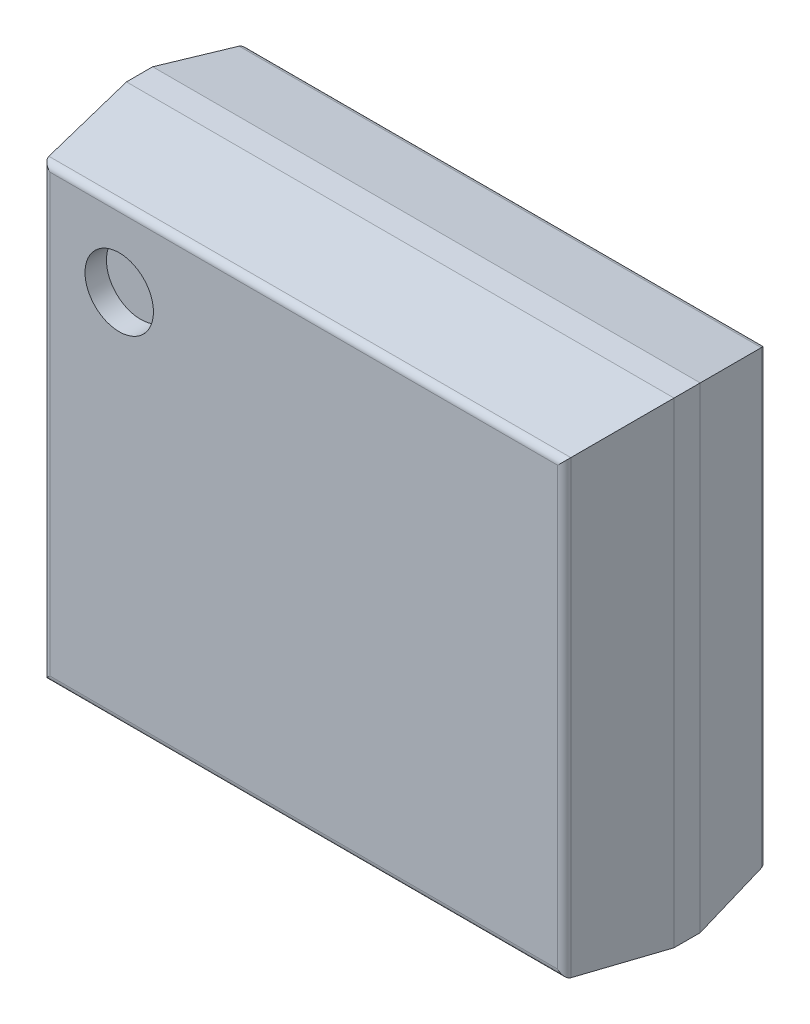
ISO-10303-21;
HEADER;
FILE_DESCRIPTION(('STEP AP214'),'2;1');
FILE_NAME('part.step','',(''),(''),'','','');
FILE_SCHEMA(('AUTOMOTIVE_DESIGN { 1 0 10303 214 1 1 1 1 }'));
ENDSEC;
DATA;
#1=APPLICATION_CONTEXT('core data for automotive mechanical design processes');
#2=APPLICATION_PROTOCOL_DEFINITION('international standard','automotive_design',2000,#1);
#3=PRODUCT_CONTEXT('',#1,'mechanical');
#4=PRODUCT('Part','Part','',(#3));
#5=PRODUCT_RELATED_PRODUCT_CATEGORY('part','',(#4));
#6=PRODUCT_DEFINITION_FORMATION('','',#4);
#7=PRODUCT_DEFINITION_CONTEXT('part definition',#1,'design');
#8=PRODUCT_DEFINITION('design','',#6,#7);
#9=PRODUCT_DEFINITION_SHAPE('','',#8);
#10=(LENGTH_UNIT() NAMED_UNIT(*) SI_UNIT(.MILLI.,.METRE.));
#11=(NAMED_UNIT(*) PLANE_ANGLE_UNIT() SI_UNIT($,.RADIAN.));
#12=(NAMED_UNIT(*) SI_UNIT($,.STERADIAN.) SOLID_ANGLE_UNIT());
#13=UNCERTAINTY_MEASURE_WITH_UNIT(LENGTH_MEASURE(1.E-05),#10,'distance_accuracy_value','');
#14=(GEOMETRIC_REPRESENTATION_CONTEXT(3) GLOBAL_UNCERTAINTY_ASSIGNED_CONTEXT((#13)) GLOBAL_UNIT_ASSIGNED_CONTEXT((#10,
#11,#12)) REPRESENTATION_CONTEXT('',''));
#15=CARTESIAN_POINT('',(0.,0.,0.));
#16=DIRECTION('',(0.,0.,1.));
#17=DIRECTION('',(1.,0.,0.));
#18=AXIS2_PLACEMENT_3D('',#15,#16,#17);
#19=CARTESIAN_POINT('',(-0.775,0.625,0.81));
#20=DIRECTION('',(0.,0.,1.));
#21=DIRECTION('',(1.,0.,0.));
#22=AXIS2_PLACEMENT_3D('',#19,#20,#21);
#23=PLANE('',#22);
#24=CARTESIAN_POINT('',(-0.775,0.625,0.81));
#25=DIRECTION('',(0.,0.,1.));
#26=DIRECTION('',(1.,0.,0.));
#27=AXIS2_PLACEMENT_3D('',#24,#25,#26);
#28=CIRCLE('',#27,0.14375);
#29=CARTESIAN_POINT('',(-0.63125,0.625,0.81));
#30=VERTEX_POINT('',#29);
#31=EDGE_CURVE('E20',#30,#30,#28,.T.);
#32=ORIENTED_EDGE('',*,*,#31,.T.);
#33=EDGE_LOOP('',(#32));
#34=FACE_BOUND('',#33,.T.);
#35=ADVANCED_FACE('F17',(#34),#23,.T.);
#36=CARTESIAN_POINT('',(-0.775,0.625,0.81));
#37=DIRECTION('',(0.,0.,1.));
#38=DIRECTION('',(1.,0.,0.));
#39=AXIS2_PLACEMENT_3D('',#36,#37,#38);
#40=CYLINDRICAL_SURFACE('',#39,0.14375);
#41=CARTESIAN_POINT('',(-0.775,0.625,0.9));
#42=DIRECTION('',(0.,0.,1.));
#43=DIRECTION('',(1.,0.,0.));
#44=AXIS2_PLACEMENT_3D('',#41,#42,#43);
#45=CIRCLE('',#44,0.14375);
#46=CARTESIAN_POINT('',(-0.63125,0.625,0.9));
#47=VERTEX_POINT('',#46);
#48=EDGE_CURVE('E100',#47,#47,#45,.F.);
#49=ORIENTED_EDGE('',*,*,#48,.F.);
#50=EDGE_LOOP('',(#49));
#51=FACE_BOUND('',#50,.T.);
#52=ORIENTED_EDGE('',*,*,#31,.F.);
#53=EDGE_LOOP('',(#52));
#54=FACE_BOUND('',#53,.T.);
#55=ADVANCED_FACE('F117',(#51,#54),#40,.F.);
#56=CARTESIAN_POINT('',(-1.15,-1.,0.9));
#57=DIRECTION('',(0.,0.,1.));
#58=DIRECTION('',(1.,0.,0.));
#59=AXIS2_PLACEMENT_3D('',#56,#57,#58);
#60=PLANE('',#59);
#61=ORIENTED_EDGE('',*,*,#48,.T.);
#62=EDGE_LOOP('',(#61));
#63=FACE_BOUND('',#62,.T.);
#64=DIRECTION('',(0.,1.,0.));
#65=VECTOR('',#64,1.);
#66=CARTESIAN_POINT('',(1.066455479683,-0.9425,0.9));
#67=LINE('',#66,#65);
#68=CARTESIAN_POINT('',(1.066455479683,0.916455479683,0.9));
#69=VERTEX_POINT('',#68);
#70=CARTESIAN_POINT('',(1.066455479683,-0.916455479683,0.9));
#71=VERTEX_POINT('',#70);
#72=EDGE_CURVE('E107',#69,#71,#67,.F.);
#73=ORIENTED_EDGE('',*,*,#72,.F.);
#74=DIRECTION('',(1.,0.,0.));
#75=VECTOR('',#74,1.);
#76=CARTESIAN_POINT('',(-1.0925,0.916455479683,0.9));
#77=LINE('',#76,#75);
#78=CARTESIAN_POINT('',(-1.066455479683,0.916455479683,0.9));
#79=VERTEX_POINT('',#78);
#80=EDGE_CURVE('E96',#79,#69,#77,.T.);
#81=ORIENTED_EDGE('',*,*,#80,.F.);
#82=DIRECTION('',(0.,1.,0.));
#83=VECTOR('',#82,1.);
#84=CARTESIAN_POINT('',(-1.066455479683,-0.9425,0.9));
#85=LINE('',#84,#83);
#86=CARTESIAN_POINT('',(-1.066455479683,-0.916455479683,0.9));
#87=VERTEX_POINT('',#86);
#88=EDGE_CURVE('E92',#87,#79,#85,.T.);
#89=ORIENTED_EDGE('',*,*,#88,.F.);
#90=DIRECTION('',(1.,0.,0.));
#91=VECTOR('',#90,1.);
#92=CARTESIAN_POINT('',(-1.0925,-0.916455479683,0.9));
#93=LINE('',#92,#91);
#94=EDGE_CURVE('E81',#71,#87,#93,.F.);
#95=ORIENTED_EDGE('',*,*,#94,.F.);
#96=EDGE_LOOP('',(#73,#81,#89,#95));
#97=FACE_BOUND('',#96,.T.);
#98=ADVANCED_FACE('F95',(#63,#97),#60,.T.);
#99=CARTESIAN_POINT('',(-1.066455479683,-0.9425,0.87));
#100=DIRECTION('',(0.,1.,0.));
#101=DIRECTION('',(0.,0.,1.));
#102=AXIS2_PLACEMENT_3D('',#99,#100,#101);
#103=CYLINDRICAL_SURFACE('',#102,0.03);
#104=CARTESIAN_POINT('',(-1.066455479683,0.916455479683,0.87));
#105=DIRECTION('',(0.707106781186547,0.707106781186547,0.));
#106=DIRECTION('',(0.707106781186547,-0.707106781186547,0.));
#107=AXIS2_PLACEMENT_3D('',#104,#105,#106);
#108=ELLIPSE('',#107,0.0424264068711928,0.03);
#109=CARTESIAN_POINT('',(-1.09615809039178,0.946158090391776,0.874213658398055));
#110=VERTEX_POINT('',#109);
#111=EDGE_CURVE('E363',#110,#79,#108,.T.);
#112=ORIENTED_EDGE('',*,*,#111,.F.);
#113=DIRECTION('',(0.,1.,0.));
#114=VECTOR('',#113,1.);
#115=CARTESIAN_POINT('',(-1.09615809039199,-1.,0.874213658397999));
#116=LINE('',#115,#114);
#117=CARTESIAN_POINT('',(-1.09615809039178,-0.946158090391776,0.874213658398055));
#118=VERTEX_POINT('',#117);
#119=EDGE_CURVE('E104',#110,#118,#116,.F.);
#120=ORIENTED_EDGE('',*,*,#119,.T.);
#121=CARTESIAN_POINT('',(-1.066455479683,-0.916455479683,0.87));
#122=DIRECTION('',(0.707106781186547,-0.707106781186547,0.));
#123=DIRECTION('',(0.707106781186547,0.707106781186547,0.));
#124=AXIS2_PLACEMENT_3D('',#121,#122,#123);
#125=ELLIPSE('',#124,0.0424264068711928,0.03);
#126=EDGE_CURVE('E86',#87,#118,#125,.T.);
#127=ORIENTED_EDGE('',*,*,#126,.F.);
#128=ORIENTED_EDGE('',*,*,#88,.T.);
#129=EDGE_LOOP('',(#112,#120,#127,#128));
#130=FACE_BOUND('',#129,.T.);
#131=ADVANCED_FACE('F103',(#130),#103,.T.);
#132=CARTESIAN_POINT('',(-1.0925,-0.916455479683,0.87));
#133=DIRECTION('',(1.,0.,0.));
#134=DIRECTION('',(0.,0.,-1.));
#135=AXIS2_PLACEMENT_3D('',#132,#133,#134);
#136=CYLINDRICAL_SURFACE('',#135,0.03);
#137=ORIENTED_EDGE('',*,*,#94,.T.);
#138=ORIENTED_EDGE('',*,*,#126,.T.);
#139=DIRECTION('',(1.,0.,0.));
#140=VECTOR('',#139,1.);
#141=CARTESIAN_POINT('',(-1.15,-0.946158090391995,0.874213658397999));
#142=LINE('',#141,#140);
#143=CARTESIAN_POINT('',(1.09615809039178,-0.946158090391778,0.874213658398055));
#144=VERTEX_POINT('',#143);
#145=EDGE_CURVE('E380',#118,#144,#142,.T.);
#146=ORIENTED_EDGE('',*,*,#145,.T.);
#147=CARTESIAN_POINT('',(1.066455479683,-0.916455479683,0.87));
#148=DIRECTION('',(0.707106781186547,0.707106781186547,0.));
#149=DIRECTION('',(-0.707106781186547,0.707106781186547,0.));
#150=AXIS2_PLACEMENT_3D('',#147,#148,#149);
#151=ELLIPSE('',#150,0.0424264068711928,0.03);
#152=EDGE_CURVE('E88',#71,#144,#151,.T.);
#153=ORIENTED_EDGE('',*,*,#152,.F.);
#154=EDGE_LOOP('',(#137,#138,#146,#153));
#155=FACE_BOUND('',#154,.T.);
#156=ADVANCED_FACE('F83',(#155),#136,.T.);
#157=CARTESIAN_POINT('',(1.066455479683,-0.9425,0.87));
#158=DIRECTION('',(0.,1.,0.));
#159=DIRECTION('',(0.,0.,1.));
#160=AXIS2_PLACEMENT_3D('',#157,#158,#159);
#161=CYLINDRICAL_SURFACE('',#160,0.03);
#162=CARTESIAN_POINT('',(1.066455479683,0.916455479683,0.87));
#163=DIRECTION('',(0.707106781186547,-0.707106781186547,0.));
#164=DIRECTION('',(0.707106781186547,0.707106781186547,0.));
#165=AXIS2_PLACEMENT_3D('',#162,#163,#164);
#166=ELLIPSE('',#165,0.0424264068711928,0.03);
#167=CARTESIAN_POINT('',(1.09615809039178,0.946158090391776,0.874213658398055));
#168=VERTEX_POINT('',#167);
#169=EDGE_CURVE('E357',#69,#168,#166,.F.);
#170=ORIENTED_EDGE('',*,*,#169,.F.);
#171=ORIENTED_EDGE('',*,*,#72,.T.);
#172=ORIENTED_EDGE('',*,*,#152,.T.);
#173=DIRECTION('',(0.,1.,0.));
#174=VECTOR('',#173,1.);
#175=CARTESIAN_POINT('',(1.09615809039199,-1.,0.874213658397999));
#176=LINE('',#175,#174);
#177=EDGE_CURVE('E359',#168,#144,#176,.F.);
#178=ORIENTED_EDGE('',*,*,#177,.F.);
#179=EDGE_LOOP('',(#170,#171,#172,#178));
#180=FACE_BOUND('',#179,.T.);
#181=ADVANCED_FACE('F200',(#180),#161,.T.);
#182=CARTESIAN_POINT('',(-1.0925,0.916455479683,0.87));
#183=DIRECTION('',(1.,0.,0.));
#184=DIRECTION('',(0.,0.,-1.));
#185=AXIS2_PLACEMENT_3D('',#182,#183,#184);
#186=CYLINDRICAL_SURFACE('',#185,0.03);
#187=DIRECTION('',(1.,0.,0.));
#188=VECTOR('',#187,1.);
#189=CARTESIAN_POINT('',(-1.15,0.946158090391995,0.874213658397999));
#190=LINE('',#189,#188);
#191=EDGE_CURVE('E385',#110,#168,#190,.T.);
#192=ORIENTED_EDGE('',*,*,#191,.F.);
#193=ORIENTED_EDGE('',*,*,#111,.T.);
#194=ORIENTED_EDGE('',*,*,#80,.T.);
#195=ORIENTED_EDGE('',*,*,#169,.T.);
#196=EDGE_LOOP('',(#192,#193,#194,#195));
#197=FACE_BOUND('',#196,.T.);
#198=ADVANCED_FACE('F196',(#197),#186,.T.);
#199=CARTESIAN_POINT('',(-1.12125,-1.,0.697337615633));
#200=DIRECTION('',(0.990087023618549,0.,-0.140455279936936));
#201=DIRECTION('',(-0.140455279936936,0.,-0.990087023618549));
#202=AXIS2_PLACEMENT_3D('',#199,#200,#201);
#203=PLANE('',#202);
#204=DIRECTION('',(0.13909001833499,-0.139090018334801,0.980463121998577));
#205=VECTOR('',#204,1.);
#206=CARTESIAN_POINT('',(-1.15,0.999999999999921,0.494675231265989));
#207=LINE('',#206,#205);
#208=CARTESIAN_POINT('',(-1.15,0.99999999999998,0.494675231265997));
#209=VERTEX_POINT('',#208);
#210=EDGE_CURVE('E408',#209,#110,#207,.T.);
#211=ORIENTED_EDGE('',*,*,#210,.F.);
#212=DIRECTION('',(0.,1.,0.));
#213=VECTOR('',#212,1.);
#214=CARTESIAN_POINT('',(-1.15,-1.,0.494675231266));
#215=LINE('',#214,#213);
#216=CARTESIAN_POINT('',(-1.15,-0.99999999999998,0.494675231265997));
#217=VERTEX_POINT('',#216);
#218=EDGE_CURVE('E426',#209,#217,#215,.F.);
#219=ORIENTED_EDGE('',*,*,#218,.T.);
#220=DIRECTION('',(0.13909001833499,0.139090018334801,0.980463121998577));
#221=VECTOR('',#220,1.);
#222=CARTESIAN_POINT('',(-1.15,-0.999999999999921,0.494675231265989));
#223=LINE('',#222,#221);
#224=EDGE_CURVE('E382',#217,#118,#223,.T.);
#225=ORIENTED_EDGE('',*,*,#224,.T.);
#226=ORIENTED_EDGE('',*,*,#119,.F.);
#227=EDGE_LOOP('',(#211,#219,#225,#226));
#228=FACE_BOUND('',#227,.T.);
#229=ADVANCED_FACE('F192',(#228),#203,.F.);
#230=CARTESIAN_POINT('',(-1.15,-0.97125,0.697337615633));
#231=DIRECTION('',(0.,0.990087023618549,-0.140455279936936));
#232=DIRECTION('',(0.,0.140455279936936,0.990087023618549));
#233=AXIS2_PLACEMENT_3D('',#230,#231,#232);
#234=PLANE('',#233);
#235=DIRECTION('',(1.,0.,0.));
#236=VECTOR('',#235,1.);
#237=CARTESIAN_POINT('',(-1.15,-1.,0.494675231266));
#238=LINE('',#237,#236);
#239=CARTESIAN_POINT('',(1.14999999999998,-1.,0.494675231265997));
#240=VERTEX_POINT('',#239);
#241=EDGE_CURVE('E395',#217,#240,#238,.T.);
#242=ORIENTED_EDGE('',*,*,#241,.T.);
#243=DIRECTION('',(0.139090018334801,-0.139090018334991,-0.980463121998577));
#244=VECTOR('',#243,1.);
#245=CARTESIAN_POINT('',(1.09615809039199,-0.946158090392,0.874213658397999));
#246=LINE('',#245,#244);
#247=EDGE_CURVE('E386',#144,#240,#246,.T.);
#248=ORIENTED_EDGE('',*,*,#247,.F.);
#249=ORIENTED_EDGE('',*,*,#145,.F.);
#250=ORIENTED_EDGE('',*,*,#224,.F.);
#251=EDGE_LOOP('',(#242,#248,#249,#250));
#252=FACE_BOUND('',#251,.T.);
#253=ADVANCED_FACE('F188',(#252),#234,.F.);
#254=CARTESIAN_POINT('',(1.12125,-1.,0.697337615633));
#255=DIRECTION('',(0.990087023618549,0.,0.140455279936936));
#256=DIRECTION('',(0.140455279936936,0.,-0.990087023618549));
#257=AXIS2_PLACEMENT_3D('',#254,#255,#256);
#258=PLANE('',#257);
#259=DIRECTION('',(0.13909001833499,0.139090018334801,-0.980463121998577));
#260=VECTOR('',#259,1.);
#261=CARTESIAN_POINT('',(1.096158090392,0.946158090391995,0.874213658397999));
#262=LINE('',#261,#260);
#263=CARTESIAN_POINT('',(1.15,0.99999999999998,0.494675231265997));
#264=VERTEX_POINT('',#263);
#265=EDGE_CURVE('E388',#168,#264,#262,.T.);
#266=ORIENTED_EDGE('',*,*,#265,.F.);
#267=ORIENTED_EDGE('',*,*,#177,.T.);
#268=ORIENTED_EDGE('',*,*,#247,.T.);
#269=DIRECTION('',(0.,1.,0.));
#270=VECTOR('',#269,1.);
#271=CARTESIAN_POINT('',(1.15,-1.,0.494675231266));
#272=LINE('',#271,#270);
#273=EDGE_CURVE('E411',#264,#240,#272,.F.);
#274=ORIENTED_EDGE('',*,*,#273,.F.);
#275=EDGE_LOOP('',(#266,#267,#268,#274));
#276=FACE_BOUND('',#275,.T.);
#277=ADVANCED_FACE('F184',(#276),#258,.T.);
#278=CARTESIAN_POINT('',(-1.15,0.97125,0.697337615633));
#279=DIRECTION('',(0.,0.990087023618549,0.140455279936936));
#280=DIRECTION('',(0.,-0.140455279936936,0.990087023618549));
#281=AXIS2_PLACEMENT_3D('',#278,#279,#280);
#282=PLANE('',#281);
#283=DIRECTION('',(1.,0.,0.));
#284=VECTOR('',#283,1.);
#285=CARTESIAN_POINT('',(-1.15,1.,0.494675231266));
#286=LINE('',#285,#284);
#287=EDGE_CURVE('E417',#209,#264,#286,.T.);
#288=ORIENTED_EDGE('',*,*,#287,.F.);
#289=ORIENTED_EDGE('',*,*,#210,.T.);
#290=ORIENTED_EDGE('',*,*,#191,.T.);
#291=ORIENTED_EDGE('',*,*,#265,.T.);
#292=EDGE_LOOP('',(#288,#289,#290,#291));
#293=FACE_BOUND('',#292,.T.);
#294=ADVANCED_FACE('F180',(#293),#282,.T.);
#295=CARTESIAN_POINT('',(-1.15,-1.,0.05));
#296=DIRECTION('',(1.,0.,0.));
#297=DIRECTION('',(0.,0.,-1.));
#298=AXIS2_PLACEMENT_3D('',#295,#296,#297);
#299=PLANE('',#298);
#300=DIRECTION('',(0.,0.,1.));
#301=VECTOR('',#300,1.);
#302=CARTESIAN_POINT('',(-1.15,1.,0.05));
#303=LINE('',#302,#301);
#304=CARTESIAN_POINT('',(-1.15000000000002,1.00000000000006,0.384675231265991));
#305=VERTEX_POINT('',#304);
#306=EDGE_CURVE('E421',#305,#209,#303,.T.);
#307=ORIENTED_EDGE('',*,*,#306,.F.);
#308=DIRECTION('',(0.,1.,0.));
#309=VECTOR('',#308,1.);
#310=CARTESIAN_POINT('',(-1.15000000000007,-1.,0.384675231265987));
#311=LINE('',#310,#309);
#312=CARTESIAN_POINT('',(-1.15000000000002,-1.00000000000004,0.384675231265991));
#313=VERTEX_POINT('',#312);
#314=EDGE_CURVE('E420',#313,#305,#311,.T.);
#315=ORIENTED_EDGE('',*,*,#314,.F.);
#316=DIRECTION('',(0.,0.,1.));
#317=VECTOR('',#316,1.);
#318=CARTESIAN_POINT('',(-1.15,-1.,0.05));
#319=LINE('',#318,#317);
#320=EDGE_CURVE('E399',#313,#217,#319,.T.);
#321=ORIENTED_EDGE('',*,*,#320,.T.);
#322=ORIENTED_EDGE('',*,*,#218,.F.);
#323=EDGE_LOOP('',(#307,#315,#321,#322));
#324=FACE_BOUND('',#323,.T.);
#325=ADVANCED_FACE('F176',(#324),#299,.F.);
#326=CARTESIAN_POINT('',(-1.15,-1.,0.05));
#327=DIRECTION('',(0.,1.,0.));
#328=DIRECTION('',(0.,0.,1.));
#329=AXIS2_PLACEMENT_3D('',#326,#327,#328);
#330=PLANE('',#329);
#331=ORIENTED_EDGE('',*,*,#320,.F.);
#332=DIRECTION('',(1.,0.,0.));
#333=VECTOR('',#332,1.);
#334=CARTESIAN_POINT('',(-1.15,-1.00000000000007,0.384675231265987));
#335=LINE('',#334,#333);
#336=CARTESIAN_POINT('',(1.15000000000004,-1.00000000000002,0.384675231265987));
#337=VERTEX_POINT('',#336);
#338=EDGE_CURVE('E437',#337,#313,#335,.F.);
#339=ORIENTED_EDGE('',*,*,#338,.F.);
#340=DIRECTION('',(0.,0.,-1.));
#341=VECTOR('',#340,1.);
#342=CARTESIAN_POINT('',(1.15,-1.,0.05));
#343=LINE('',#342,#341);
#344=EDGE_CURVE('E398',#240,#337,#343,.T.);
#345=ORIENTED_EDGE('',*,*,#344,.F.);
#346=ORIENTED_EDGE('',*,*,#241,.F.);
#347=EDGE_LOOP('',(#331,#339,#345,#346));
#348=FACE_BOUND('',#347,.T.);
#349=ADVANCED_FACE('F172',(#348),#330,.F.);
#350=CARTESIAN_POINT('',(1.15,-1.,0.05));
#351=DIRECTION('',(1.,0.,0.));
#352=DIRECTION('',(0.,0.,-1.));
#353=AXIS2_PLACEMENT_3D('',#350,#351,#352);
#354=PLANE('',#353);
#355=DIRECTION('',(0.,0.,1.));
#356=VECTOR('',#355,1.);
#357=CARTESIAN_POINT('',(1.15,1.,0.05));
#358=LINE('',#357,#356);
#359=CARTESIAN_POINT('',(1.15000000000002,1.00000000000004,0.384675231265987));
#360=VERTEX_POINT('',#359);
#361=EDGE_CURVE('E414',#264,#360,#358,.F.);
#362=ORIENTED_EDGE('',*,*,#361,.F.);
#363=ORIENTED_EDGE('',*,*,#273,.T.);
#364=ORIENTED_EDGE('',*,*,#344,.T.);
#365=DIRECTION('',(0.,1.,0.));
#366=VECTOR('',#365,1.);
#367=CARTESIAN_POINT('',(1.15000000000007,-1.,0.384675231265987));
#368=LINE('',#367,#366);
#369=EDGE_CURVE('E447',#337,#360,#368,.T.);
#370=ORIENTED_EDGE('',*,*,#369,.T.);
#371=EDGE_LOOP('',(#362,#363,#364,#370));
#372=FACE_BOUND('',#371,.T.);
#373=ADVANCED_FACE('F168',(#372),#354,.T.);
#374=CARTESIAN_POINT('',(-1.15,1.,0.05));
#375=DIRECTION('',(0.,1.,0.));
#376=DIRECTION('',(0.,0.,1.));
#377=AXIS2_PLACEMENT_3D('',#374,#375,#376);
#378=PLANE('',#377);
#379=ORIENTED_EDGE('',*,*,#306,.T.);
#380=ORIENTED_EDGE('',*,*,#287,.T.);
#381=ORIENTED_EDGE('',*,*,#361,.T.);
#382=DIRECTION('',(1.,0.,0.));
#383=VECTOR('',#382,1.);
#384=CARTESIAN_POINT('',(-1.15,1.00000000000007,0.384675231265987));
#385=LINE('',#384,#383);
#386=EDGE_CURVE('E462',#360,#305,#385,.F.);
#387=ORIENTED_EDGE('',*,*,#386,.T.);
#388=EDGE_LOOP('',(#379,#380,#381,#387));
#389=FACE_BOUND('',#388,.T.);
#390=ADVANCED_FACE('F164',(#389),#378,.T.);
#391=CARTESIAN_POINT('',(-1.12125,-1.,0.217337615633));
#392=DIRECTION('',(-0.985559854435905,0.,-0.169327414567984));
#393=DIRECTION('',(-0.169327414567984,0.,0.985559854435905));
#394=AXIS2_PLACEMENT_3D('',#391,#392,#393);
#395=PLANE('',#394);
#396=DIRECTION('',(0.16695093889078,-0.166950938890655,-0.971727723185366));
#397=VECTOR('',#396,1.);
#398=CARTESIAN_POINT('',(-1.15,1.00000000000007,0.384675231265987));
#399=LINE('',#398,#397);
#400=CARTESIAN_POINT('',(-1.09678149464304,0.946781494643086,0.0749201775629562));
#401=VERTEX_POINT('',#400);
#402=EDGE_CURVE('E465',#305,#401,#399,.T.);
#403=ORIENTED_EDGE('',*,*,#402,.T.);
#404=DIRECTION('',(0.,1.,0.));
#405=VECTOR('',#404,1.);
#406=CARTESIAN_POINT('',(-1.09678149464308,-0.9425,0.0749201775629568));
#407=LINE('',#406,#405);
#408=CARTESIAN_POINT('',(-1.09678149464304,-0.946781494643086,0.0749201775629562));
#409=VERTEX_POINT('',#408);
#410=EDGE_CURVE('E370',#409,#401,#407,.T.);
#411=ORIENTED_EDGE('',*,*,#410,.F.);
#412=DIRECTION('',(0.16695093889078,0.166950938890655,-0.971727723185366));
#413=VECTOR('',#412,1.);
#414=CARTESIAN_POINT('',(-1.15,-1.00000000000007,0.384675231265987));
#415=LINE('',#414,#413);
#416=EDGE_CURVE('E440',#313,#409,#415,.T.);
#417=ORIENTED_EDGE('',*,*,#416,.F.);
#418=ORIENTED_EDGE('',*,*,#314,.T.);
#419=EDGE_LOOP('',(#403,#411,#417,#418));
#420=FACE_BOUND('',#419,.T.);
#421=ADVANCED_FACE('F160',(#420),#395,.T.);
#422=CARTESIAN_POINT('',(-1.15,-0.97125,0.217337615633));
#423=DIRECTION('',(0.,-0.985559854435905,-0.169327414567984));
#424=DIRECTION('',(0.,0.169327414567984,-0.985559854435905));
#425=AXIS2_PLACEMENT_3D('',#422,#423,#424);
#426=PLANE('',#425);
#427=ORIENTED_EDGE('',*,*,#338,.T.);
#428=ORIENTED_EDGE('',*,*,#416,.T.);
#429=DIRECTION('',(1.,0.,0.));
#430=VECTOR('',#429,1.);
#431=CARTESIAN_POINT('',(-1.0925,-0.946781494643077,0.0749201775629569));
#432=LINE('',#431,#430);
#433=CARTESIAN_POINT('',(1.09678149464309,-0.946781494643038,0.0749201775629562));
#434=VERTEX_POINT('',#433);
#435=EDGE_CURVE('E369',#434,#409,#432,.F.);
#436=ORIENTED_EDGE('',*,*,#435,.F.);
#437=DIRECTION('',(0.166950938890655,-0.16695093889078,0.971727723185366));
#438=VECTOR('',#437,1.);
#439=CARTESIAN_POINT('',(1.09678149464311,-0.946781494643,0.0749201775629505));
#440=LINE('',#439,#438);
#441=EDGE_CURVE('E451',#434,#337,#440,.T.);
#442=ORIENTED_EDGE('',*,*,#441,.T.);
#443=EDGE_LOOP('',(#427,#428,#436,#442));
#444=FACE_BOUND('',#443,.T.);
#445=ADVANCED_FACE('F156',(#444),#426,.T.);
#446=CARTESIAN_POINT('',(1.12125,-1.,0.217337615633));
#447=DIRECTION('',(-0.985559854435905,0.,0.169327414567984));
#448=DIRECTION('',(0.169327414567984,0.,0.985559854435905));
#449=AXIS2_PLACEMENT_3D('',#446,#447,#448);
#450=PLANE('',#449);
#451=DIRECTION('',(0.16695093889078,0.166950938890655,0.971727723185366));
#452=VECTOR('',#451,1.);
#453=CARTESIAN_POINT('',(1.096781494643,0.946781494643113,0.0749201775629505));
#454=LINE('',#453,#452);
#455=CARTESIAN_POINT('',(1.09678149464304,0.946781494643086,0.0749201775629562));
#456=VERTEX_POINT('',#455);
#457=EDGE_CURVE('E450',#456,#360,#454,.T.);
#458=ORIENTED_EDGE('',*,*,#457,.T.);
#459=ORIENTED_EDGE('',*,*,#369,.F.);
#460=ORIENTED_EDGE('',*,*,#441,.F.);
#461=DIRECTION('',(0.,1.,0.));
#462=VECTOR('',#461,1.);
#463=CARTESIAN_POINT('',(1.09678149464308,-0.9425,0.0749201775629568));
#464=LINE('',#463,#462);
#465=EDGE_CURVE('E374',#456,#434,#464,.F.);
#466=ORIENTED_EDGE('',*,*,#465,.F.);
#467=EDGE_LOOP('',(#458,#459,#460,#466));
#468=FACE_BOUND('',#467,.T.);
#469=ADVANCED_FACE('F152',(#468),#450,.F.);
#470=CARTESIAN_POINT('',(-1.15,0.97125,0.217337615633));
#471=DIRECTION('',(0.,-0.985559854435905,0.169327414567984));
#472=DIRECTION('',(0.,-0.169327414567984,-0.985559854435905));
#473=AXIS2_PLACEMENT_3D('',#470,#471,#472);
#474=PLANE('',#473);
#475=ORIENTED_EDGE('',*,*,#386,.F.);
#476=ORIENTED_EDGE('',*,*,#457,.F.);
#477=DIRECTION('',(1.,0.,0.));
#478=VECTOR('',#477,1.);
#479=CARTESIAN_POINT('',(-1.0925,0.946781494643077,0.0749201775629568));
#480=LINE('',#479,#478);
#481=EDGE_CURVE('E377',#401,#456,#480,.T.);
#482=ORIENTED_EDGE('',*,*,#481,.F.);
#483=ORIENTED_EDGE('',*,*,#402,.F.);
#484=EDGE_LOOP('',(#475,#476,#482,#483));
#485=FACE_BOUND('',#484,.T.);
#486=ADVANCED_FACE('F148',(#485),#474,.F.);
#487=CARTESIAN_POINT('',(-1.06721469901,-0.9425,0.08));
#488=DIRECTION('',(0.,1.,0.));
#489=DIRECTION('',(0.,0.,1.));
#490=AXIS2_PLACEMENT_3D('',#487,#488,#489);
#491=CYLINDRICAL_SURFACE('',#490,0.03);
#492=DIRECTION('',(0.,1.,0.));
#493=VECTOR('',#492,1.);
#494=CARTESIAN_POINT('',(-1.06721469901,-1.,0.05));
#495=LINE('',#494,#493);
#496=CARTESIAN_POINT('',(-1.06721469901,0.91721469901,0.05));
#497=VERTEX_POINT('',#496);
#498=CARTESIAN_POINT('',(-1.06721469901,-0.91721469901,0.05));
#499=VERTEX_POINT('',#498);
#500=EDGE_CURVE('E378',#497,#499,#495,.F.);
#501=ORIENTED_EDGE('',*,*,#500,.T.);
#502=CARTESIAN_POINT('',(-1.06721469901,-0.91721469901,0.08));
#503=DIRECTION('',(0.707106781186547,-0.707106781186547,0.));
#504=DIRECTION('',(0.707106781186547,0.707106781186547,0.));
#505=AXIS2_PLACEMENT_3D('',#502,#503,#504);
#506=ELLIPSE('',#505,0.0424264068711929,0.03);
#507=EDGE_CURVE('E367',#409,#499,#506,.T.);
#508=ORIENTED_EDGE('',*,*,#507,.F.);
#509=ORIENTED_EDGE('',*,*,#410,.T.);
#510=CARTESIAN_POINT('',(-1.06721469901,0.91721469901,0.08));
#511=DIRECTION('',(0.707106781186547,0.707106781186547,0.));
#512=DIRECTION('',(0.707106781186547,-0.707106781186547,0.));
#513=AXIS2_PLACEMENT_3D('',#510,#511,#512);
#514=ELLIPSE('',#513,0.0424264068711929,0.03);
#515=EDGE_CURVE('E373',#497,#401,#514,.T.);
#516=ORIENTED_EDGE('',*,*,#515,.F.);
#517=EDGE_LOOP('',(#501,#508,#509,#516));
#518=FACE_BOUND('',#517,.T.);
#519=ADVANCED_FACE('F144',(#518),#491,.T.);
#520=CARTESIAN_POINT('',(-1.0925,-0.91721469901,0.08));
#521=DIRECTION('',(1.,0.,0.));
#522=DIRECTION('',(0.,0.,-1.));
#523=AXIS2_PLACEMENT_3D('',#520,#521,#522);
#524=CYLINDRICAL_SURFACE('',#523,0.03);
#525=CARTESIAN_POINT('',(1.06721469901,-0.91721469901,0.08));
#526=DIRECTION('',(0.707106781186547,0.707106781186547,0.));
#527=DIRECTION('',(-0.707106781186547,0.707106781186547,0.));
#528=AXIS2_PLACEMENT_3D('',#525,#526,#527);
#529=ELLIPSE('',#528,0.0424264068711929,0.03);
#530=CARTESIAN_POINT('',(1.06721469901,-0.91721469901,0.05));
#531=VERTEX_POINT('',#530);
#532=EDGE_CURVE('E371',#434,#531,#529,.T.);
#533=ORIENTED_EDGE('',*,*,#532,.F.);
#534=ORIENTED_EDGE('',*,*,#435,.T.);
#535=ORIENTED_EDGE('',*,*,#507,.T.);
#536=DIRECTION('',(1.,0.,0.));
#537=VECTOR('',#536,1.);
#538=CARTESIAN_POINT('',(-1.15,-0.91721469901,0.05));
#539=LINE('',#538,#537);
#540=EDGE_CURVE('E488',#499,#531,#539,.T.);
#541=ORIENTED_EDGE('',*,*,#540,.T.);
#542=EDGE_LOOP('',(#533,#534,#535,#541));
#543=FACE_BOUND('',#542,.T.);
#544=ADVANCED_FACE('F140',(#543),#524,.T.);
#545=CARTESIAN_POINT('',(1.06721469901,-0.9425,0.08));
#546=DIRECTION('',(0.,1.,0.));
#547=DIRECTION('',(0.,0.,1.));
#548=AXIS2_PLACEMENT_3D('',#545,#546,#547);
#549=CYLINDRICAL_SURFACE('',#548,0.03);
#550=ORIENTED_EDGE('',*,*,#465,.T.);
#551=ORIENTED_EDGE('',*,*,#532,.T.);
#552=DIRECTION('',(0.,1.,0.));
#553=VECTOR('',#552,1.);
#554=CARTESIAN_POINT('',(1.06721469901,-1.,0.05));
#555=LINE('',#554,#553);
#556=CARTESIAN_POINT('',(1.06721469901,0.91721469901,0.05));
#557=VERTEX_POINT('',#556);
#558=EDGE_CURVE('E26',#531,#557,#555,.T.);
#559=ORIENTED_EDGE('',*,*,#558,.T.);
#560=CARTESIAN_POINT('',(1.06721469901,0.91721469901,0.08));
#561=DIRECTION('',(0.707106781186547,-0.707106781186547,0.));
#562=DIRECTION('',(0.707106781186547,0.707106781186547,0.));
#563=AXIS2_PLACEMENT_3D('',#560,#561,#562);
#564=ELLIPSE('',#563,0.0424264068711928,0.03);
#565=EDGE_CURVE('E34',#456,#557,#564,.F.);
#566=ORIENTED_EDGE('',*,*,#565,.F.);
#567=EDGE_LOOP('',(#550,#551,#559,#566));
#568=FACE_BOUND('',#567,.T.);
#569=ADVANCED_FACE('F134',(#568),#549,.T.);
#570=CARTESIAN_POINT('',(-1.0925,0.91721469901,0.08));
#571=DIRECTION('',(1.,0.,0.));
#572=DIRECTION('',(0.,0.,-1.));
#573=AXIS2_PLACEMENT_3D('',#570,#571,#572);
#574=CYLINDRICAL_SURFACE('',#573,0.03);
#575=ORIENTED_EDGE('',*,*,#565,.T.);
#576=DIRECTION('',(1.,0.,0.));
#577=VECTOR('',#576,1.);
#578=CARTESIAN_POINT('',(-1.15,0.91721469901,0.05));
#579=LINE('',#578,#577);
#580=EDGE_CURVE('E11',#557,#497,#579,.F.);
#581=ORIENTED_EDGE('',*,*,#580,.T.);
#582=ORIENTED_EDGE('',*,*,#515,.T.);
#583=ORIENTED_EDGE('',*,*,#481,.T.);
#584=EDGE_LOOP('',(#575,#581,#582,#583));
#585=FACE_BOUND('',#584,.T.);
#586=ADVANCED_FACE('F128',(#585),#574,.T.);
#587=CARTESIAN_POINT('',(-1.15,-1.,0.05));
#588=DIRECTION('',(0.,0.,1.));
#589=DIRECTION('',(1.,0.,0.));
#590=AXIS2_PLACEMENT_3D('',#587,#588,#589);
#591=PLANE('',#590);
#592=ORIENTED_EDGE('',*,*,#558,.F.);
#593=ORIENTED_EDGE('',*,*,#540,.F.);
#594=ORIENTED_EDGE('',*,*,#500,.F.);
#595=ORIENTED_EDGE('',*,*,#580,.F.);
#596=EDGE_LOOP('',(#592,#593,#594,#595));
#597=FACE_BOUND('',#596,.T.);
#598=ADVANCED_FACE('F126',(#597),#591,.F.);
#599=CLOSED_SHELL('',(#35,#55,#98,#131,#156,#181,#198,#229,#253,#277,#294,#325,#349,#373,#390,
#421,#445,#469,#486,#519,#544,#569,#586,#598));
#600=MANIFOLD_SOLID_BREP('B1',#599);
#601=ADVANCED_BREP_SHAPE_REPRESENTATION('',(#18,#600),#14);
#602=SHAPE_DEFINITION_REPRESENTATION(#9,#601);
ENDSEC;
END-ISO-10303-21;
